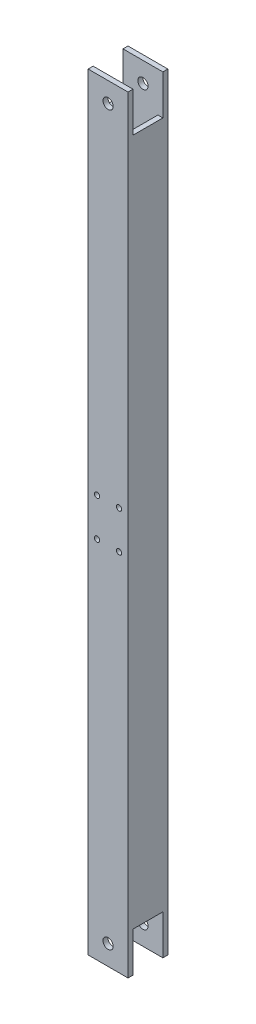
ISO-10303-21;
HEADER;
FILE_DESCRIPTION(('STEP AP214'),'2;1');
FILE_NAME('part.step','',(''),(''),'','','');
FILE_SCHEMA(('AUTOMOTIVE_DESIGN { 1 0 10303 214 1 1 1 1 }'));
ENDSEC;
DATA;
#1=APPLICATION_CONTEXT('core data for automotive mechanical design processes');
#2=APPLICATION_PROTOCOL_DEFINITION('international standard','automotive_design',2000,#1);
#3=PRODUCT_CONTEXT('',#1,'mechanical');
#4=PRODUCT('Part','Part','',(#3));
#5=PRODUCT_RELATED_PRODUCT_CATEGORY('part','',(#4));
#6=PRODUCT_DEFINITION_FORMATION('','',#4);
#7=PRODUCT_DEFINITION_CONTEXT('part definition',#1,'design');
#8=PRODUCT_DEFINITION('design','',#6,#7);
#9=PRODUCT_DEFINITION_SHAPE('','',#8);
#10=(LENGTH_UNIT() NAMED_UNIT(*) SI_UNIT(.MILLI.,.METRE.));
#11=(NAMED_UNIT(*) PLANE_ANGLE_UNIT() SI_UNIT($,.RADIAN.));
#12=(NAMED_UNIT(*) SI_UNIT($,.STERADIAN.) SOLID_ANGLE_UNIT());
#13=UNCERTAINTY_MEASURE_WITH_UNIT(LENGTH_MEASURE(1.E-05),#10,'distance_accuracy_value','');
#14=(GEOMETRIC_REPRESENTATION_CONTEXT(3) GLOBAL_UNCERTAINTY_ASSIGNED_CONTEXT((#13)) GLOBAL_UNIT_ASSIGNED_CONTEXT((#10,
#11,#12)) REPRESENTATION_CONTEXT('',''));
#15=CARTESIAN_POINT('',(0.,0.,0.));
#16=DIRECTION('',(0.,0.,1.));
#17=DIRECTION('',(1.,0.,0.));
#18=AXIS2_PLACEMENT_3D('',#15,#16,#17);
#19=CARTESIAN_POINT('',(0.,488.95,0.));
#20=DIRECTION('',(0.,1.,0.));
#21=DIRECTION('',(0.,0.,1.));
#22=AXIS2_PLACEMENT_3D('',#19,#20,#21);
#23=PLANE('',#22);
#24=DIRECTION('',(0.,0.,-1.));
#25=VECTOR('',#24,1.);
#26=CARTESIAN_POINT('',(25.4,488.95,0.));
#27=LINE('',#26,#25);
#28=CARTESIAN_POINT('',(25.4,488.95,25.4));
#29=VERTEX_POINT('',#28);
#30=CARTESIAN_POINT('',(25.4,488.95,22.225));
#31=VERTEX_POINT('',#30);
#32=EDGE_CURVE('E174',#29,#31,#27,.T.);
#33=ORIENTED_EDGE('',*,*,#32,.T.);
#34=DIRECTION('',(1.,0.,0.));
#35=VECTOR('',#34,1.);
#36=CARTESIAN_POINT('',(3.175,488.95,22.225));
#37=LINE('',#36,#35);
#38=CARTESIAN_POINT('',(0.,488.95,22.225));
#39=VERTEX_POINT('',#38);
#40=EDGE_CURVE('E155',#39,#31,#37,.T.);
#41=ORIENTED_EDGE('',*,*,#40,.F.);
#42=DIRECTION('',(0.,0.,1.));
#43=VECTOR('',#42,1.);
#44=CARTESIAN_POINT('',(0.,488.95,0.));
#45=LINE('',#44,#43);
#46=CARTESIAN_POINT('',(0.,488.95,25.4));
#47=VERTEX_POINT('',#46);
#48=EDGE_CURVE('E203',#39,#47,#45,.T.);
#49=ORIENTED_EDGE('',*,*,#48,.T.);
#50=DIRECTION('',(1.,0.,0.));
#51=VECTOR('',#50,1.);
#52=CARTESIAN_POINT('',(0.,488.95,25.4));
#53=LINE('',#52,#51);
#54=EDGE_CURVE('E181',#47,#29,#53,.T.);
#55=ORIENTED_EDGE('',*,*,#54,.T.);
#56=EDGE_LOOP('',(#33,#41,#49,#55));
#57=FACE_BOUND('',#56,.T.);
#58=ADVANCED_FACE('F41',(#57),#23,.T.);
#59=CARTESIAN_POINT('',(0.,488.95,0.));
#60=VERTEX_POINT('',#59);
#61=CARTESIAN_POINT('',(0.,488.95,3.175));
#62=VERTEX_POINT('',#61);
#63=EDGE_CURVE('E336',#60,#62,#45,.T.);
#64=ORIENTED_EDGE('',*,*,#63,.T.);
#65=DIRECTION('',(-1.,0.,0.));
#66=VECTOR('',#65,1.);
#67=CARTESIAN_POINT('',(3.175,488.95,3.175));
#68=LINE('',#67,#66);
#69=CARTESIAN_POINT('',(25.4,488.95,3.175));
#70=VERTEX_POINT('',#69);
#71=EDGE_CURVE('E166',#70,#62,#68,.T.);
#72=ORIENTED_EDGE('',*,*,#71,.F.);
#73=CARTESIAN_POINT('',(25.4,488.95,0.));
#74=VERTEX_POINT('',#73);
#75=EDGE_CURVE('E184',#70,#74,#27,.T.);
#76=ORIENTED_EDGE('',*,*,#75,.T.);
#77=DIRECTION('',(-1.,0.,0.));
#78=VECTOR('',#77,1.);
#79=CARTESIAN_POINT('',(0.,488.95,0.));
#80=LINE('',#79,#78);
#81=EDGE_CURVE('E183',#74,#60,#80,.T.);
#82=ORIENTED_EDGE('',*,*,#81,.T.);
#83=EDGE_LOOP('',(#64,#72,#76,#82));
#84=FACE_BOUND('',#83,.T.);
#85=ADVANCED_FACE('F374',(#84),#23,.T.);
#86=CARTESIAN_POINT('',(0.,488.95,0.));
#87=DIRECTION('',(1.,0.,0.));
#88=DIRECTION('',(0.,0.,-1.));
#89=AXIS2_PLACEMENT_3D('',#86,#87,#88);
#90=PLANE('',#89);
#91=DIRECTION('',(0.,-1.,0.));
#92=VECTOR('',#91,1.);
#93=CARTESIAN_POINT('',(0.,463.54943048716,22.225));
#94=LINE('',#93,#92);
#95=CARTESIAN_POINT('',(0.,463.54943048716,22.225));
#96=VERTEX_POINT('',#95);
#97=EDGE_CURVE('E162',#39,#96,#94,.T.);
#98=ORIENTED_EDGE('',*,*,#97,.T.);
#99=DIRECTION('',(0.,0.,-1.));
#100=VECTOR('',#99,1.);
#101=CARTESIAN_POINT('',(0.,463.54943048716,3.175));
#102=LINE('',#101,#100);
#103=CARTESIAN_POINT('',(0.,463.54943048716,3.175));
#104=VERTEX_POINT('',#103);
#105=EDGE_CURVE('E178',#96,#104,#102,.T.);
#106=ORIENTED_EDGE('',*,*,#105,.T.);
#107=DIRECTION('',(0.,1.,0.));
#108=VECTOR('',#107,1.);
#109=CARTESIAN_POINT('',(0.,488.95,3.175));
#110=LINE('',#109,#108);
#111=EDGE_CURVE('E248',#104,#62,#110,.T.);
#112=ORIENTED_EDGE('',*,*,#111,.T.);
#113=ORIENTED_EDGE('',*,*,#63,.F.);
#114=DIRECTION('',(0.,-1.,0.));
#115=VECTOR('',#114,1.);
#116=CARTESIAN_POINT('',(0.,488.95,0.));
#117=LINE('',#116,#115);
#118=CARTESIAN_POINT('',(0.,0.,0.));
#119=VERTEX_POINT('',#118);
#120=EDGE_CURVE('E186',#60,#119,#117,.T.);
#121=ORIENTED_EDGE('',*,*,#120,.T.);
#122=DIRECTION('',(0.,0.,1.));
#123=VECTOR('',#122,1.);
#124=CARTESIAN_POINT('',(0.,0.,0.));
#125=LINE('',#124,#123);
#126=CARTESIAN_POINT('',(0.,0.,3.175));
#127=VERTEX_POINT('',#126);
#128=EDGE_CURVE('E191',#119,#127,#125,.T.);
#129=ORIENTED_EDGE('',*,*,#128,.T.);
#130=DIRECTION('',(0.,-1.,0.));
#131=VECTOR('',#130,1.);
#132=CARTESIAN_POINT('',(0.,0.,3.175));
#133=LINE('',#132,#131);
#134=CARTESIAN_POINT('',(0.,25.4005695128399,3.175));
#135=VERTEX_POINT('',#134);
#136=EDGE_CURVE('E269',#135,#127,#133,.T.);
#137=ORIENTED_EDGE('',*,*,#136,.F.);
#138=DIRECTION('',(0.,0.,-1.));
#139=VECTOR('',#138,1.);
#140=CARTESIAN_POINT('',(0.,25.4005695128399,3.175));
#141=LINE('',#140,#139);
#142=CARTESIAN_POINT('',(0.,25.4005695128399,22.225));
#143=VERTEX_POINT('',#142);
#144=EDGE_CURVE('E278',#143,#135,#141,.T.);
#145=ORIENTED_EDGE('',*,*,#144,.F.);
#146=DIRECTION('',(0.,1.,0.));
#147=VECTOR('',#146,1.);
#148=CARTESIAN_POINT('',(0.,25.4005695128399,22.225));
#149=LINE('',#148,#147);
#150=CARTESIAN_POINT('',(0.,0.,22.225));
#151=VERTEX_POINT('',#150);
#152=EDGE_CURVE('E264',#151,#143,#149,.T.);
#153=ORIENTED_EDGE('',*,*,#152,.F.);
#154=CARTESIAN_POINT('',(0.,0.,25.4));
#155=VERTEX_POINT('',#154);
#156=EDGE_CURVE('E195',#151,#155,#125,.T.);
#157=ORIENTED_EDGE('',*,*,#156,.T.);
#158=DIRECTION('',(0.,-1.,0.));
#159=VECTOR('',#158,1.);
#160=CARTESIAN_POINT('',(0.,488.95,25.4));
#161=LINE('',#160,#159);
#162=EDGE_CURVE('E11',#47,#155,#161,.T.);
#163=ORIENTED_EDGE('',*,*,#162,.F.);
#164=ORIENTED_EDGE('',*,*,#48,.F.);
#165=EDGE_LOOP('',(#98,#106,#112,#113,#121,#129,#137,#145,#153,#157,#163,#164));
#166=FACE_BOUND('',#165,.T.);
#167=ADVANCED_FACE('F43',(#166),#90,.F.);
#168=CARTESIAN_POINT('',(25.4,488.95,0.));
#169=DIRECTION('',(-1.,0.,0.));
#170=DIRECTION('',(0.,0.,1.));
#171=AXIS2_PLACEMENT_3D('',#168,#169,#170);
#172=PLANE('',#171);
#173=DIRECTION('',(0.,-1.,0.));
#174=VECTOR('',#173,1.);
#175=CARTESIAN_POINT('',(25.4,463.54943048716,22.225));
#176=LINE('',#175,#174);
#177=CARTESIAN_POINT('',(25.4,463.54943048716,22.225));
#178=VERTEX_POINT('',#177);
#179=EDGE_CURVE('E159',#31,#178,#176,.T.);
#180=ORIENTED_EDGE('',*,*,#179,.F.);
#181=ORIENTED_EDGE('',*,*,#32,.F.);
#182=DIRECTION('',(0.,-1.,0.));
#183=VECTOR('',#182,1.);
#184=CARTESIAN_POINT('',(25.4,488.95,25.4));
#185=LINE('',#184,#183);
#186=CARTESIAN_POINT('',(25.4,0.,25.4));
#187=VERTEX_POINT('',#186);
#188=EDGE_CURVE('E50',#29,#187,#185,.T.);
#189=ORIENTED_EDGE('',*,*,#188,.T.);
#190=DIRECTION('',(0.,0.,-1.));
#191=VECTOR('',#190,1.);
#192=CARTESIAN_POINT('',(25.4,0.,0.));
#193=LINE('',#192,#191);
#194=CARTESIAN_POINT('',(25.4,0.,22.225));
#195=VERTEX_POINT('',#194);
#196=EDGE_CURVE('E198',#187,#195,#193,.T.);
#197=ORIENTED_EDGE('',*,*,#196,.T.);
#198=DIRECTION('',(0.,1.,0.));
#199=VECTOR('',#198,1.);
#200=CARTESIAN_POINT('',(25.4,25.4005695128399,22.225));
#201=LINE('',#200,#199);
#202=CARTESIAN_POINT('',(25.4,25.4005695128399,22.225));
#203=VERTEX_POINT('',#202);
#204=EDGE_CURVE('E265',#195,#203,#201,.T.);
#205=ORIENTED_EDGE('',*,*,#204,.T.);
#206=DIRECTION('',(0.,0.,-1.));
#207=VECTOR('',#206,1.);
#208=CARTESIAN_POINT('',(25.4,25.4005695128399,3.175));
#209=LINE('',#208,#207);
#210=CARTESIAN_POINT('',(25.4,25.4005695128399,3.175));
#211=VERTEX_POINT('',#210);
#212=EDGE_CURVE('E268',#203,#211,#209,.T.);
#213=ORIENTED_EDGE('',*,*,#212,.T.);
#214=DIRECTION('',(0.,-1.,0.));
#215=VECTOR('',#214,1.);
#216=CARTESIAN_POINT('',(25.4,0.,3.175));
#217=LINE('',#216,#215);
#218=CARTESIAN_POINT('',(25.4,0.,3.175));
#219=VERTEX_POINT('',#218);
#220=EDGE_CURVE('E272',#211,#219,#217,.T.);
#221=ORIENTED_EDGE('',*,*,#220,.T.);
#222=CARTESIAN_POINT('',(25.4,0.,0.));
#223=VERTEX_POINT('',#222);
#224=EDGE_CURVE('E197',#219,#223,#193,.T.);
#225=ORIENTED_EDGE('',*,*,#224,.T.);
#226=DIRECTION('',(0.,-1.,0.));
#227=VECTOR('',#226,1.);
#228=CARTESIAN_POINT('',(25.4,488.95,0.));
#229=LINE('',#228,#227);
#230=EDGE_CURVE('E206',#74,#223,#229,.T.);
#231=ORIENTED_EDGE('',*,*,#230,.F.);
#232=ORIENTED_EDGE('',*,*,#75,.F.);
#233=DIRECTION('',(0.,1.,0.));
#234=VECTOR('',#233,1.);
#235=CARTESIAN_POINT('',(25.4,488.95,3.175));
#236=LINE('',#235,#234);
#237=CARTESIAN_POINT('',(25.4,463.54943048716,3.175));
#238=VERTEX_POINT('',#237);
#239=EDGE_CURVE('E177',#238,#70,#236,.T.);
#240=ORIENTED_EDGE('',*,*,#239,.F.);
#241=DIRECTION('',(0.,0.,-1.));
#242=VECTOR('',#241,1.);
#243=CARTESIAN_POINT('',(25.4,463.54943048716,3.175));
#244=LINE('',#243,#242);
#245=EDGE_CURVE('E176',#178,#238,#244,.T.);
#246=ORIENTED_EDGE('',*,*,#245,.F.);
#247=EDGE_LOOP('',(#180,#181,#189,#197,#205,#213,#221,#225,#231,#232,#240,#246));
#248=FACE_BOUND('',#247,.T.);
#249=ADVANCED_FACE('F172',(#248),#172,.F.);
#250=CARTESIAN_POINT('',(3.175,488.95,3.175));
#251=DIRECTION('',(1.,0.,0.));
#252=DIRECTION('',(0.,0.,-1.));
#253=AXIS2_PLACEMENT_3D('',#250,#251,#252);
#254=PLANE('',#253);
#255=DIRECTION('',(0.,-1.,0.));
#256=VECTOR('',#255,1.);
#257=CARTESIAN_POINT('',(3.175,488.95,3.175));
#258=LINE('',#257,#256);
#259=CARTESIAN_POINT('',(3.175,463.54943048716,3.175));
#260=VERTEX_POINT('',#259);
#261=CARTESIAN_POINT('',(3.175,25.4005695128399,3.175));
#262=VERTEX_POINT('',#261);
#263=EDGE_CURVE('E328',#260,#262,#258,.T.);
#264=ORIENTED_EDGE('',*,*,#263,.F.);
#265=DIRECTION('',(0.,0.,1.));
#266=VECTOR('',#265,1.);
#267=CARTESIAN_POINT('',(3.175,463.54943048716,3.175));
#268=LINE('',#267,#266);
#269=CARTESIAN_POINT('',(3.175,463.54943048716,22.225));
#270=VERTEX_POINT('',#269);
#271=EDGE_CURVE('E261',#260,#270,#268,.T.);
#272=ORIENTED_EDGE('',*,*,#271,.T.);
#273=DIRECTION('',(0.,-1.,0.));
#274=VECTOR('',#273,1.);
#275=CARTESIAN_POINT('',(3.175,488.95,22.225));
#276=LINE('',#275,#274);
#277=CARTESIAN_POINT('',(3.17500000000001,25.4005695128399,22.225));
#278=VERTEX_POINT('',#277);
#279=EDGE_CURVE('E335',#270,#278,#276,.T.);
#280=ORIENTED_EDGE('',*,*,#279,.T.);
#281=DIRECTION('',(0.,0.,1.));
#282=VECTOR('',#281,1.);
#283=CARTESIAN_POINT('',(3.175,25.4005695128399,3.175));
#284=LINE('',#283,#282);
#285=EDGE_CURVE('E292',#262,#278,#284,.T.);
#286=ORIENTED_EDGE('',*,*,#285,.F.);
#287=EDGE_LOOP('',(#264,#272,#280,#286));
#288=FACE_BOUND('',#287,.T.);
#289=ADVANCED_FACE('F383',(#288),#254,.T.);
#290=CARTESIAN_POINT('',(22.225,488.95,3.175));
#291=DIRECTION('',(-1.,0.,0.));
#292=DIRECTION('',(0.,0.,1.));
#293=AXIS2_PLACEMENT_3D('',#290,#291,#292);
#294=PLANE('',#293);
#295=DIRECTION('',(0.,-1.,0.));
#296=VECTOR('',#295,1.);
#297=CARTESIAN_POINT('',(22.225,488.95,22.225));
#298=LINE('',#297,#296);
#299=CARTESIAN_POINT('',(22.225,463.54943048716,22.225));
#300=VERTEX_POINT('',#299);
#301=CARTESIAN_POINT('',(22.225,25.4005695128399,22.225));
#302=VERTEX_POINT('',#301);
#303=EDGE_CURVE('E66',#300,#302,#298,.T.);
#304=ORIENTED_EDGE('',*,*,#303,.F.);
#305=DIRECTION('',(0.,0.,-1.));
#306=VECTOR('',#305,1.);
#307=CARTESIAN_POINT('',(22.225,463.54943048716,3.175));
#308=LINE('',#307,#306);
#309=CARTESIAN_POINT('',(22.225,463.54943048716,3.175));
#310=VERTEX_POINT('',#309);
#311=EDGE_CURVE('E255',#300,#310,#308,.T.);
#312=ORIENTED_EDGE('',*,*,#311,.T.);
#313=DIRECTION('',(0.,-1.,0.));
#314=VECTOR('',#313,1.);
#315=CARTESIAN_POINT('',(22.225,488.95,3.175));
#316=LINE('',#315,#314);
#317=CARTESIAN_POINT('',(22.225,25.4005695128399,3.175));
#318=VERTEX_POINT('',#317);
#319=EDGE_CURVE('E332',#310,#318,#316,.T.);
#320=ORIENTED_EDGE('',*,*,#319,.T.);
#321=DIRECTION('',(0.,0.,-1.));
#322=VECTOR('',#321,1.);
#323=CARTESIAN_POINT('',(22.225,25.4005695128399,3.175));
#324=LINE('',#323,#322);
#325=EDGE_CURVE('E286',#302,#318,#324,.T.);
#326=ORIENTED_EDGE('',*,*,#325,.F.);
#327=EDGE_LOOP('',(#304,#312,#320,#326));
#328=FACE_BOUND('',#327,.T.);
#329=ADVANCED_FACE('F451',(#328),#294,.T.);
#330=CARTESIAN_POINT('',(0.,0.,0.));
#331=DIRECTION('',(0.,1.,0.));
#332=DIRECTION('',(0.,0.,1.));
#333=AXIS2_PLACEMENT_3D('',#330,#331,#332);
#334=PLANE('',#333);
#335=ORIENTED_EDGE('',*,*,#156,.F.);
#336=DIRECTION('',(1.,0.,0.));
#337=VECTOR('',#336,1.);
#338=CARTESIAN_POINT('',(3.175,0.,22.225));
#339=LINE('',#338,#337);
#340=EDGE_CURVE('E325',#151,#195,#339,.T.);
#341=ORIENTED_EDGE('',*,*,#340,.T.);
#342=ORIENTED_EDGE('',*,*,#196,.F.);
#343=DIRECTION('',(1.,0.,0.));
#344=VECTOR('',#343,1.);
#345=CARTESIAN_POINT('',(0.,0.,25.4));
#346=LINE('',#345,#344);
#347=EDGE_CURVE('E194',#155,#187,#346,.T.);
#348=ORIENTED_EDGE('',*,*,#347,.F.);
#349=EDGE_LOOP('',(#335,#341,#342,#348));
#350=FACE_BOUND('',#349,.T.);
#351=ADVANCED_FACE('F350',(#350),#334,.F.);
#352=ORIENTED_EDGE('',*,*,#224,.F.);
#353=DIRECTION('',(-1.,0.,0.));
#354=VECTOR('',#353,1.);
#355=CARTESIAN_POINT('',(3.175,0.,3.175));
#356=LINE('',#355,#354);
#357=EDGE_CURVE('E167',#219,#127,#356,.T.);
#358=ORIENTED_EDGE('',*,*,#357,.T.);
#359=ORIENTED_EDGE('',*,*,#128,.F.);
#360=DIRECTION('',(-1.,0.,0.));
#361=VECTOR('',#360,1.);
#362=CARTESIAN_POINT('',(0.,0.,0.));
#363=LINE('',#362,#361);
#364=EDGE_CURVE('E201',#223,#119,#363,.T.);
#365=ORIENTED_EDGE('',*,*,#364,.F.);
#366=EDGE_LOOP('',(#352,#358,#359,#365));
#367=FACE_BOUND('',#366,.T.);
#368=ADVANCED_FACE('F364',(#367),#334,.F.);
#369=CARTESIAN_POINT('',(0.,488.95,25.4));
#370=DIRECTION('',(0.,0.,-1.));
#371=DIRECTION('',(-1.,0.,0.));
#372=AXIS2_PLACEMENT_3D('',#369,#370,#371);
#373=PLANE('',#372);
#374=CARTESIAN_POINT('',(12.7,476.25,25.4));
#375=DIRECTION('',(0.,0.,-1.));
#376=DIRECTION('',(1.,0.,0.));
#377=AXIS2_PLACEMENT_3D('',#374,#375,#376);
#378=CIRCLE('',#377,3.2639);
#379=CARTESIAN_POINT('',(15.9639,476.25,25.4));
#380=VERTEX_POINT('',#379);
#381=EDGE_CURVE('E399',#380,#380,#378,.T.);
#382=ORIENTED_EDGE('',*,*,#381,.T.);
#383=EDGE_LOOP('',(#382));
#384=FACE_BOUND('',#383,.T.);
#385=CARTESIAN_POINT('',(12.7,12.7,25.4));
#386=DIRECTION('',(0.,0.,1.));
#387=DIRECTION('',(1.,0.,0.));
#388=AXIS2_PLACEMENT_3D('',#385,#386,#387);
#389=CIRCLE('',#388,3.2639);
#390=CARTESIAN_POINT('',(15.9639,12.7,25.4));
#391=VERTEX_POINT('',#390);
#392=EDGE_CURVE('E235',#391,#391,#389,.T.);
#393=ORIENTED_EDGE('',*,*,#392,.F.);
#394=EDGE_LOOP('',(#393));
#395=FACE_BOUND('',#394,.T.);
#396=CARTESIAN_POINT('',(5.69999999999998,232.350644347018,25.4));
#397=DIRECTION('',(0.,0.,-1.));
#398=DIRECTION('',(-1.,0.,0.));
#399=AXIS2_PLACEMENT_3D('',#396,#397,#398);
#400=CIRCLE('',#399,1.7);
#401=CARTESIAN_POINT('',(3.99999999999998,232.350644347018,25.4));
#402=VERTEX_POINT('',#401);
#403=EDGE_CURVE('E295',#402,#402,#400,.F.);
#404=ORIENTED_EDGE('',*,*,#403,.F.);
#405=EDGE_LOOP('',(#404));
#406=FACE_BOUND('',#405,.T.);
#407=CARTESIAN_POINT('',(19.7,232.350644347018,25.4));
#408=DIRECTION('',(0.,0.,-1.));
#409=DIRECTION('',(-1.,0.,0.));
#410=AXIS2_PLACEMENT_3D('',#407,#408,#409);
#411=CIRCLE('',#410,1.69999999999999);
#412=CARTESIAN_POINT('',(18.,232.350644347018,25.4));
#413=VERTEX_POINT('',#412);
#414=EDGE_CURVE('E304',#413,#413,#411,.F.);
#415=ORIENTED_EDGE('',*,*,#414,.F.);
#416=EDGE_LOOP('',(#415));
#417=FACE_BOUND('',#416,.T.);
#418=CARTESIAN_POINT('',(19.7,256.599355652982,25.4));
#419=DIRECTION('',(0.,0.,-1.));
#420=DIRECTION('',(-1.,0.,0.));
#421=AXIS2_PLACEMENT_3D('',#418,#419,#420);
#422=CIRCLE('',#421,1.69999999999998);
#423=CARTESIAN_POINT('',(18.,256.599355652982,25.4));
#424=VERTEX_POINT('',#423);
#425=EDGE_CURVE('E296',#424,#424,#422,.F.);
#426=ORIENTED_EDGE('',*,*,#425,.F.);
#427=EDGE_LOOP('',(#426));
#428=FACE_BOUND('',#427,.T.);
#429=CARTESIAN_POINT('',(5.70000000000001,256.599355652982,25.4));
#430=DIRECTION('',(0.,0.,-1.));
#431=DIRECTION('',(-1.,0.,0.));
#432=AXIS2_PLACEMENT_3D('',#429,#430,#431);
#433=CIRCLE('',#432,1.69999999999998);
#434=CARTESIAN_POINT('',(4.00000000000003,256.599355652982,25.4));
#435=VERTEX_POINT('',#434);
#436=EDGE_CURVE('E214',#435,#435,#433,.F.);
#437=ORIENTED_EDGE('',*,*,#436,.F.);
#438=EDGE_LOOP('',(#437));
#439=FACE_BOUND('',#438,.T.);
#440=ORIENTED_EDGE('',*,*,#347,.T.);
#441=ORIENTED_EDGE('',*,*,#188,.F.);
#442=ORIENTED_EDGE('',*,*,#54,.F.);
#443=ORIENTED_EDGE('',*,*,#162,.T.);
#444=EDGE_LOOP('',(#440,#441,#442,#443));
#445=FACE_BOUND('',#444,.T.);
#446=ADVANCED_FACE('F343',(#384,#395,#406,#417,#428,#439,#445),#373,.F.);
#447=CARTESIAN_POINT('',(0.,488.95,0.));
#448=DIRECTION('',(0.,0.,1.));
#449=DIRECTION('',(1.,0.,0.));
#450=AXIS2_PLACEMENT_3D('',#447,#448,#449);
#451=PLANE('',#450);
#452=CARTESIAN_POINT('',(12.7,476.25,0.));
#453=DIRECTION('',(0.,0.,1.));
#454=DIRECTION('',(1.,0.,0.));
#455=AXIS2_PLACEMENT_3D('',#452,#453,#454);
#456=CIRCLE('',#455,3.2639);
#457=CARTESIAN_POINT('',(15.9639,476.25,0.));
#458=VERTEX_POINT('',#457);
#459=EDGE_CURVE('E592',#458,#458,#456,.T.);
#460=ORIENTED_EDGE('',*,*,#459,.T.);
#461=EDGE_LOOP('',(#460));
#462=FACE_BOUND('',#461,.T.);
#463=CARTESIAN_POINT('',(12.7,12.7,0.));
#464=DIRECTION('',(0.,0.,1.));
#465=DIRECTION('',(1.,0.,0.));
#466=AXIS2_PLACEMENT_3D('',#463,#464,#465);
#467=CIRCLE('',#466,3.2639);
#468=CARTESIAN_POINT('',(15.9639,12.7,0.));
#469=VERTEX_POINT('',#468);
#470=EDGE_CURVE('E229',#469,#469,#467,.F.);
#471=ORIENTED_EDGE('',*,*,#470,.F.);
#472=EDGE_LOOP('',(#471));
#473=FACE_BOUND('',#472,.T.);
#474=CARTESIAN_POINT('',(5.69999999999998,232.350644347018,0.));
#475=DIRECTION('',(0.,0.,-1.));
#476=DIRECTION('',(-1.,0.,0.));
#477=AXIS2_PLACEMENT_3D('',#474,#475,#476);
#478=CIRCLE('',#477,1.7);
#479=CARTESIAN_POINT('',(3.99999999999998,232.350644347018,0.));
#480=VERTEX_POINT('',#479);
#481=EDGE_CURVE('E307',#480,#480,#478,.T.);
#482=ORIENTED_EDGE('',*,*,#481,.F.);
#483=EDGE_LOOP('',(#482));
#484=FACE_BOUND('',#483,.T.);
#485=CARTESIAN_POINT('',(19.7,232.350644347018,0.));
#486=DIRECTION('',(0.,0.,-1.));
#487=DIRECTION('',(-1.,0.,0.));
#488=AXIS2_PLACEMENT_3D('',#485,#486,#487);
#489=CIRCLE('',#488,1.69999999999999);
#490=CARTESIAN_POINT('',(18.,232.350644347018,0.));
#491=VERTEX_POINT('',#490);
#492=EDGE_CURVE('E300',#491,#491,#489,.T.);
#493=ORIENTED_EDGE('',*,*,#492,.F.);
#494=EDGE_LOOP('',(#493));
#495=FACE_BOUND('',#494,.T.);
#496=CARTESIAN_POINT('',(19.7,256.599355652982,0.));
#497=DIRECTION('',(0.,0.,-1.));
#498=DIRECTION('',(-1.,0.,0.));
#499=AXIS2_PLACEMENT_3D('',#496,#497,#498);
#500=CIRCLE('',#499,1.69999999999998);
#501=CARTESIAN_POINT('',(18.,256.599355652982,0.));
#502=VERTEX_POINT('',#501);
#503=EDGE_CURVE('E299',#502,#502,#500,.T.);
#504=ORIENTED_EDGE('',*,*,#503,.F.);
#505=EDGE_LOOP('',(#504));
#506=FACE_BOUND('',#505,.T.);
#507=CARTESIAN_POINT('',(5.70000000000001,256.599355652982,0.));
#508=DIRECTION('',(0.,0.,-1.));
#509=DIRECTION('',(-1.,0.,0.));
#510=AXIS2_PLACEMENT_3D('',#507,#508,#509);
#511=CIRCLE('',#510,1.69999999999998);
#512=CARTESIAN_POINT('',(4.00000000000003,256.599355652982,0.));
#513=VERTEX_POINT('',#512);
#514=EDGE_CURVE('E303',#513,#513,#511,.T.);
#515=ORIENTED_EDGE('',*,*,#514,.F.);
#516=EDGE_LOOP('',(#515));
#517=FACE_BOUND('',#516,.T.);
#518=ORIENTED_EDGE('',*,*,#364,.T.);
#519=ORIENTED_EDGE('',*,*,#120,.F.);
#520=ORIENTED_EDGE('',*,*,#81,.F.);
#521=ORIENTED_EDGE('',*,*,#230,.T.);
#522=EDGE_LOOP('',(#518,#519,#520,#521));
#523=FACE_BOUND('',#522,.T.);
#524=ADVANCED_FACE('F368',(#462,#473,#484,#495,#506,#517,#523),#451,.F.);
#525=CARTESIAN_POINT('',(3.175,488.95,22.225));
#526=DIRECTION('',(0.,0.,-1.));
#527=DIRECTION('',(-1.,0.,0.));
#528=AXIS2_PLACEMENT_3D('',#525,#526,#527);
#529=PLANE('',#528);
#530=CARTESIAN_POINT('',(12.7,476.25,22.225));
#531=DIRECTION('',(0.,0.,-1.));
#532=DIRECTION('',(-1.,0.,0.));
#533=AXIS2_PLACEMENT_3D('',#530,#531,#532);
#534=CIRCLE('',#533,3.2639);
#535=CARTESIAN_POINT('',(9.4361,476.25,22.225));
#536=VERTEX_POINT('',#535);
#537=EDGE_CURVE('E240',#536,#536,#534,.F.);
#538=ORIENTED_EDGE('',*,*,#537,.T.);
#539=EDGE_LOOP('',(#538));
#540=FACE_BOUND('',#539,.T.);
#541=CARTESIAN_POINT('',(12.7,12.7,22.225));
#542=DIRECTION('',(0.,0.,-1.));
#543=DIRECTION('',(-1.,0.,0.));
#544=AXIS2_PLACEMENT_3D('',#541,#542,#543);
#545=CIRCLE('',#544,3.2639);
#546=CARTESIAN_POINT('',(9.4361,12.7,22.225));
#547=VERTEX_POINT('',#546);
#548=EDGE_CURVE('E228',#547,#547,#545,.T.);
#549=ORIENTED_EDGE('',*,*,#548,.F.);
#550=EDGE_LOOP('',(#549));
#551=FACE_BOUND('',#550,.T.);
#552=DIRECTION('',(-1.,0.,0.));
#553=VECTOR('',#552,1.);
#554=CARTESIAN_POINT('',(25.4,463.54943048716,22.225));
#555=LINE('',#554,#553);
#556=EDGE_CURVE('E253',#178,#300,#555,.T.);
#557=ORIENTED_EDGE('',*,*,#556,.T.);
#558=ORIENTED_EDGE('',*,*,#303,.T.);
#559=DIRECTION('',(-1.,0.,0.));
#560=VECTOR('',#559,1.);
#561=CARTESIAN_POINT('',(25.4,25.4005695128399,22.225));
#562=LINE('',#561,#560);
#563=EDGE_CURVE('E288',#203,#302,#562,.T.);
#564=ORIENTED_EDGE('',*,*,#563,.F.);
#565=ORIENTED_EDGE('',*,*,#204,.F.);
#566=ORIENTED_EDGE('',*,*,#340,.F.);
#567=ORIENTED_EDGE('',*,*,#152,.T.);
#568=EDGE_CURVE('E275',#278,#143,#562,.T.);
#569=ORIENTED_EDGE('',*,*,#568,.F.);
#570=ORIENTED_EDGE('',*,*,#279,.F.);
#571=EDGE_CURVE('E256',#270,#96,#555,.T.);
#572=ORIENTED_EDGE('',*,*,#571,.T.);
#573=ORIENTED_EDGE('',*,*,#97,.F.);
#574=ORIENTED_EDGE('',*,*,#40,.T.);
#575=ORIENTED_EDGE('',*,*,#179,.T.);
#576=EDGE_LOOP('',(#557,#558,#564,#565,#566,#567,#569,#570,#572,#573,#574,#575));
#577=FACE_BOUND('',#576,.T.);
#578=CARTESIAN_POINT('',(5.69999999999998,232.350644347018,22.225));
#579=DIRECTION('',(0.,0.,-1.));
#580=DIRECTION('',(-1.,0.,0.));
#581=AXIS2_PLACEMENT_3D('',#578,#579,#580);
#582=CIRCLE('',#581,1.7);
#583=CARTESIAN_POINT('',(3.99999999999998,232.350644347018,22.225));
#584=VERTEX_POINT('',#583);
#585=EDGE_CURVE('E225',#584,#584,#582,.T.);
#586=ORIENTED_EDGE('',*,*,#585,.F.);
#587=EDGE_LOOP('',(#586));
#588=FACE_BOUND('',#587,.T.);
#589=CARTESIAN_POINT('',(19.7,232.350644347018,22.225));
#590=DIRECTION('',(0.,0.,-1.));
#591=DIRECTION('',(-1.,0.,0.));
#592=AXIS2_PLACEMENT_3D('',#589,#590,#591);
#593=CIRCLE('',#592,1.69999999999999);
#594=CARTESIAN_POINT('',(18.,232.350644347018,22.225));
#595=VERTEX_POINT('',#594);
#596=EDGE_CURVE('E222',#595,#595,#593,.T.);
#597=ORIENTED_EDGE('',*,*,#596,.F.);
#598=EDGE_LOOP('',(#597));
#599=FACE_BOUND('',#598,.T.);
#600=CARTESIAN_POINT('',(19.7,256.599355652982,22.225));
#601=DIRECTION('',(0.,0.,-1.));
#602=DIRECTION('',(-1.,0.,0.));
#603=AXIS2_PLACEMENT_3D('',#600,#601,#602);
#604=CIRCLE('',#603,1.69999999999998);
#605=CARTESIAN_POINT('',(18.,256.599355652982,22.225));
#606=VERTEX_POINT('',#605);
#607=EDGE_CURVE('E218',#606,#606,#604,.T.);
#608=ORIENTED_EDGE('',*,*,#607,.F.);
#609=EDGE_LOOP('',(#608));
#610=FACE_BOUND('',#609,.T.);
#611=CARTESIAN_POINT('',(5.70000000000001,256.599355652982,22.225));
#612=DIRECTION('',(0.,0.,-1.));
#613=DIRECTION('',(-1.,0.,0.));
#614=AXIS2_PLACEMENT_3D('',#611,#612,#613);
#615=CIRCLE('',#614,1.69999999999998);
#616=CARTESIAN_POINT('',(4.00000000000003,256.599355652982,22.225));
#617=VERTEX_POINT('',#616);
#618=EDGE_CURVE('E213',#617,#617,#615,.T.);
#619=ORIENTED_EDGE('',*,*,#618,.F.);
#620=EDGE_LOOP('',(#619));
#621=FACE_BOUND('',#620,.T.);
#622=ADVANCED_FACE('F157',(#540,#551,#577,#588,#599,#610,#621),#529,.T.);
#623=CARTESIAN_POINT('',(3.175,488.95,3.175));
#624=DIRECTION('',(0.,0.,1.));
#625=DIRECTION('',(1.,0.,0.));
#626=AXIS2_PLACEMENT_3D('',#623,#624,#625);
#627=PLANE('',#626);
#628=CARTESIAN_POINT('',(12.7,476.25,3.175));
#629=DIRECTION('',(0.,0.,1.));
#630=DIRECTION('',(1.,0.,0.));
#631=AXIS2_PLACEMENT_3D('',#628,#629,#630);
#632=CIRCLE('',#631,3.2639);
#633=CARTESIAN_POINT('',(15.9639,476.25,3.175));
#634=VERTEX_POINT('',#633);
#635=EDGE_CURVE('E45',#634,#634,#632,.F.);
#636=ORIENTED_EDGE('',*,*,#635,.T.);
#637=EDGE_LOOP('',(#636));
#638=FACE_BOUND('',#637,.T.);
#639=CARTESIAN_POINT('',(12.7,12.7,3.175));
#640=DIRECTION('',(0.,0.,1.));
#641=DIRECTION('',(1.,0.,0.));
#642=AXIS2_PLACEMENT_3D('',#639,#640,#641);
#643=CIRCLE('',#642,3.2639);
#644=CARTESIAN_POINT('',(15.9639,12.7,3.175));
#645=VERTEX_POINT('',#644);
#646=EDGE_CURVE('E226',#645,#645,#643,.T.);
#647=ORIENTED_EDGE('',*,*,#646,.F.);
#648=EDGE_LOOP('',(#647));
#649=FACE_BOUND('',#648,.T.);
#650=ORIENTED_EDGE('',*,*,#71,.T.);
#651=ORIENTED_EDGE('',*,*,#111,.F.);
#652=DIRECTION('',(-1.,0.,0.));
#653=VECTOR('',#652,1.);
#654=CARTESIAN_POINT('',(25.4,463.54943048716,3.175));
#655=LINE('',#654,#653);
#656=EDGE_CURVE('E58',#260,#104,#655,.T.);
#657=ORIENTED_EDGE('',*,*,#656,.F.);
#658=ORIENTED_EDGE('',*,*,#263,.T.);
#659=DIRECTION('',(-1.,0.,0.));
#660=VECTOR('',#659,1.);
#661=CARTESIAN_POINT('',(25.4,25.4005695128399,3.175));
#662=LINE('',#661,#660);
#663=EDGE_CURVE('E287',#262,#135,#662,.T.);
#664=ORIENTED_EDGE('',*,*,#663,.T.);
#665=ORIENTED_EDGE('',*,*,#136,.T.);
#666=ORIENTED_EDGE('',*,*,#357,.F.);
#667=ORIENTED_EDGE('',*,*,#220,.F.);
#668=EDGE_CURVE('E283',#211,#318,#662,.T.);
#669=ORIENTED_EDGE('',*,*,#668,.T.);
#670=ORIENTED_EDGE('',*,*,#319,.F.);
#671=EDGE_CURVE('E257',#238,#310,#655,.T.);
#672=ORIENTED_EDGE('',*,*,#671,.F.);
#673=ORIENTED_EDGE('',*,*,#239,.T.);
#674=EDGE_LOOP('',(#650,#651,#657,#658,#664,#665,#666,#667,#669,#670,#672,#673));
#675=FACE_BOUND('',#674,.T.);
#676=CARTESIAN_POINT('',(5.69999999999998,232.350644347018,3.175));
#677=DIRECTION('',(0.,0.,1.));
#678=DIRECTION('',(1.,0.,0.));
#679=AXIS2_PLACEMENT_3D('',#676,#677,#678);
#680=CIRCLE('',#679,1.7);
#681=CARTESIAN_POINT('',(7.39999999999998,232.350644347018,3.175));
#682=VERTEX_POINT('',#681);
#683=EDGE_CURVE('E223',#682,#682,#680,.T.);
#684=ORIENTED_EDGE('',*,*,#683,.F.);
#685=EDGE_LOOP('',(#684));
#686=FACE_BOUND('',#685,.T.);
#687=CARTESIAN_POINT('',(19.7,232.350644347018,3.175));
#688=DIRECTION('',(0.,0.,1.));
#689=DIRECTION('',(1.,0.,0.));
#690=AXIS2_PLACEMENT_3D('',#687,#688,#689);
#691=CIRCLE('',#690,1.69999999999999);
#692=CARTESIAN_POINT('',(21.4,232.350644347018,3.175));
#693=VERTEX_POINT('',#692);
#694=EDGE_CURVE('E219',#693,#693,#691,.T.);
#695=ORIENTED_EDGE('',*,*,#694,.F.);
#696=EDGE_LOOP('',(#695));
#697=FACE_BOUND('',#696,.T.);
#698=CARTESIAN_POINT('',(19.7,256.599355652982,3.175));
#699=DIRECTION('',(0.,0.,1.));
#700=DIRECTION('',(1.,0.,0.));
#701=AXIS2_PLACEMENT_3D('',#698,#699,#700);
#702=CIRCLE('',#701,1.69999999999998);
#703=CARTESIAN_POINT('',(21.3999999999999,256.599355652982,3.175));
#704=VERTEX_POINT('',#703);
#705=EDGE_CURVE('E215',#704,#704,#702,.T.);
#706=ORIENTED_EDGE('',*,*,#705,.F.);
#707=EDGE_LOOP('',(#706));
#708=FACE_BOUND('',#707,.T.);
#709=CARTESIAN_POINT('',(5.70000000000001,256.599355652982,3.175));
#710=DIRECTION('',(0.,0.,1.));
#711=DIRECTION('',(1.,0.,0.));
#712=AXIS2_PLACEMENT_3D('',#709,#710,#711);
#713=CIRCLE('',#712,1.69999999999998);
#714=CARTESIAN_POINT('',(7.39999999999999,256.599355652982,3.175));
#715=VERTEX_POINT('',#714);
#716=EDGE_CURVE('E210',#715,#715,#713,.T.);
#717=ORIENTED_EDGE('',*,*,#716,.F.);
#718=EDGE_LOOP('',(#717));
#719=FACE_BOUND('',#718,.T.);
#720=ADVANCED_FACE('F358',(#638,#649,#675,#686,#697,#708,#719),#627,.T.);
#721=CARTESIAN_POINT('',(5.70000000000001,256.599355652982,30.2083261120685));
#722=DIRECTION('',(0.,0.,-1.));
#723=DIRECTION('',(-1.,0.,0.));
#724=AXIS2_PLACEMENT_3D('',#721,#722,#723);
#725=CYLINDRICAL_SURFACE('',#724,1.69999999999998);
#726=ORIENTED_EDGE('',*,*,#716,.T.);
#727=EDGE_LOOP('',(#726));
#728=FACE_BOUND('',#727,.T.);
#729=ORIENTED_EDGE('',*,*,#514,.T.);
#730=EDGE_LOOP('',(#729));
#731=FACE_BOUND('',#730,.T.);
#732=ADVANCED_FACE('F416',(#728,#731),#725,.F.);
#733=CARTESIAN_POINT('',(19.7,256.599355652982,30.2083261120685));
#734=DIRECTION('',(0.,0.,-1.));
#735=DIRECTION('',(-1.,0.,0.));
#736=AXIS2_PLACEMENT_3D('',#733,#734,#735);
#737=CYLINDRICAL_SURFACE('',#736,1.69999999999998);
#738=ORIENTED_EDGE('',*,*,#705,.T.);
#739=EDGE_LOOP('',(#738));
#740=FACE_BOUND('',#739,.T.);
#741=ORIENTED_EDGE('',*,*,#503,.T.);
#742=EDGE_LOOP('',(#741));
#743=FACE_BOUND('',#742,.T.);
#744=ADVANCED_FACE('F424',(#740,#743),#737,.F.);
#745=CARTESIAN_POINT('',(19.7,232.350644347018,30.2083261120685));
#746=DIRECTION('',(0.,0.,-1.));
#747=DIRECTION('',(-1.,0.,0.));
#748=AXIS2_PLACEMENT_3D('',#745,#746,#747);
#749=CYLINDRICAL_SURFACE('',#748,1.69999999999999);
#750=ORIENTED_EDGE('',*,*,#694,.T.);
#751=EDGE_LOOP('',(#750));
#752=FACE_BOUND('',#751,.T.);
#753=ORIENTED_EDGE('',*,*,#492,.T.);
#754=EDGE_LOOP('',(#753));
#755=FACE_BOUND('',#754,.T.);
#756=ADVANCED_FACE('F425',(#752,#755),#749,.F.);
#757=CARTESIAN_POINT('',(5.69999999999998,232.350644347018,30.2083261120685));
#758=DIRECTION('',(0.,0.,-1.));
#759=DIRECTION('',(-1.,0.,0.));
#760=AXIS2_PLACEMENT_3D('',#757,#758,#759);
#761=CYLINDRICAL_SURFACE('',#760,1.7);
#762=ORIENTED_EDGE('',*,*,#683,.T.);
#763=EDGE_LOOP('',(#762));
#764=FACE_BOUND('',#763,.T.);
#765=ORIENTED_EDGE('',*,*,#481,.T.);
#766=EDGE_LOOP('',(#765));
#767=FACE_BOUND('',#766,.T.);
#768=ADVANCED_FACE('F413',(#764,#767),#761,.F.);
#769=ORIENTED_EDGE('',*,*,#618,.T.);
#770=EDGE_LOOP('',(#769));
#771=FACE_BOUND('',#770,.T.);
#772=ORIENTED_EDGE('',*,*,#436,.T.);
#773=EDGE_LOOP('',(#772));
#774=FACE_BOUND('',#773,.T.);
#775=ADVANCED_FACE('F410',(#771,#774),#725,.F.);
#776=ORIENTED_EDGE('',*,*,#607,.T.);
#777=EDGE_LOOP('',(#776));
#778=FACE_BOUND('',#777,.T.);
#779=ORIENTED_EDGE('',*,*,#425,.T.);
#780=EDGE_LOOP('',(#779));
#781=FACE_BOUND('',#780,.T.);
#782=ADVANCED_FACE('F412',(#778,#781),#737,.F.);
#783=ORIENTED_EDGE('',*,*,#596,.T.);
#784=EDGE_LOOP('',(#783));
#785=FACE_BOUND('',#784,.T.);
#786=ORIENTED_EDGE('',*,*,#414,.T.);
#787=EDGE_LOOP('',(#786));
#788=FACE_BOUND('',#787,.T.);
#789=ADVANCED_FACE('F421',(#785,#788),#749,.F.);
#790=ORIENTED_EDGE('',*,*,#585,.T.);
#791=EDGE_LOOP('',(#790));
#792=FACE_BOUND('',#791,.T.);
#793=ORIENTED_EDGE('',*,*,#403,.T.);
#794=EDGE_LOOP('',(#793));
#795=FACE_BOUND('',#794,.T.);
#796=ADVANCED_FACE('F428',(#792,#795),#761,.F.);
#797=CARTESIAN_POINT('',(25.4,25.4005695128399,3.175));
#798=DIRECTION('',(0.,1.,0.));
#799=DIRECTION('',(0.,0.,1.));
#800=AXIS2_PLACEMENT_3D('',#797,#798,#799);
#801=PLANE('',#800);
#802=ORIENTED_EDGE('',*,*,#325,.T.);
#803=ORIENTED_EDGE('',*,*,#668,.F.);
#804=ORIENTED_EDGE('',*,*,#212,.F.);
#805=ORIENTED_EDGE('',*,*,#563,.T.);
#806=EDGE_LOOP('',(#802,#803,#804,#805));
#807=FACE_BOUND('',#806,.T.);
#808=ADVANCED_FACE('F355',(#807),#801,.F.);
#809=ORIENTED_EDGE('',*,*,#285,.T.);
#810=ORIENTED_EDGE('',*,*,#568,.T.);
#811=ORIENTED_EDGE('',*,*,#144,.T.);
#812=ORIENTED_EDGE('',*,*,#663,.F.);
#813=EDGE_LOOP('',(#809,#810,#811,#812));
#814=FACE_BOUND('',#813,.T.);
#815=ADVANCED_FACE('F463',(#814),#801,.F.);
#816=CARTESIAN_POINT('',(25.4,463.54943048716,3.175));
#817=DIRECTION('',(0.,1.,0.));
#818=DIRECTION('',(0.,0.,1.));
#819=AXIS2_PLACEMENT_3D('',#816,#817,#818);
#820=PLANE('',#819);
#821=ORIENTED_EDGE('',*,*,#556,.F.);
#822=ORIENTED_EDGE('',*,*,#245,.T.);
#823=ORIENTED_EDGE('',*,*,#671,.T.);
#824=ORIENTED_EDGE('',*,*,#311,.F.);
#825=EDGE_LOOP('',(#821,#822,#823,#824));
#826=FACE_BOUND('',#825,.T.);
#827=ADVANCED_FACE('F461',(#826),#820,.T.);
#828=ORIENTED_EDGE('',*,*,#656,.T.);
#829=ORIENTED_EDGE('',*,*,#105,.F.);
#830=ORIENTED_EDGE('',*,*,#571,.F.);
#831=ORIENTED_EDGE('',*,*,#271,.F.);
#832=EDGE_LOOP('',(#828,#829,#830,#831));
#833=FACE_BOUND('',#832,.T.);
#834=ADVANCED_FACE('F462',(#833),#820,.T.);
#835=CARTESIAN_POINT('',(12.7,12.7,-9.2317032924591));
#836=DIRECTION('',(0.,0.,1.));
#837=DIRECTION('',(1.,0.,0.));
#838=AXIS2_PLACEMENT_3D('',#835,#836,#837);
#839=CYLINDRICAL_SURFACE('',#838,3.2639);
#840=ORIENTED_EDGE('',*,*,#646,.T.);
#841=EDGE_LOOP('',(#840));
#842=FACE_BOUND('',#841,.T.);
#843=ORIENTED_EDGE('',*,*,#470,.T.);
#844=EDGE_LOOP('',(#843));
#845=FACE_BOUND('',#844,.T.);
#846=ADVANCED_FACE('F468',(#842,#845),#839,.F.);
#847=ORIENTED_EDGE('',*,*,#548,.T.);
#848=EDGE_LOOP('',(#847));
#849=FACE_BOUND('',#848,.T.);
#850=ORIENTED_EDGE('',*,*,#392,.T.);
#851=EDGE_LOOP('',(#850));
#852=FACE_BOUND('',#851,.T.);
#853=ADVANCED_FACE('F563',(#849,#852),#839,.F.);
#854=CARTESIAN_POINT('',(12.7,476.25,-9.23170329245907));
#855=DIRECTION('',(0.,0.,1.));
#856=DIRECTION('',(1.,0.,0.));
#857=AXIS2_PLACEMENT_3D('',#854,#855,#856);
#858=CYLINDRICAL_SURFACE('',#857,3.2639);
#859=ORIENTED_EDGE('',*,*,#635,.F.);
#860=EDGE_LOOP('',(#859));
#861=FACE_BOUND('',#860,.T.);
#862=ORIENTED_EDGE('',*,*,#459,.F.);
#863=EDGE_LOOP('',(#862));
#864=FACE_BOUND('',#863,.T.);
#865=ADVANCED_FACE('F570',(#861,#864),#858,.F.);
#866=ORIENTED_EDGE('',*,*,#537,.F.);
#867=EDGE_LOOP('',(#866));
#868=FACE_BOUND('',#867,.T.);
#869=ORIENTED_EDGE('',*,*,#381,.F.);
#870=EDGE_LOOP('',(#869));
#871=FACE_BOUND('',#870,.T.);
#872=ADVANCED_FACE('F578',(#868,#871),#858,.F.);
#873=CLOSED_SHELL('',(#58,#85,#167,#249,#289,#329,#351,#368,#446,#524,#622,#720,#732,#744,#756,
#768,#775,#782,#789,#796,#808,#815,#827,#834,#846,#853,#865,#872));
#874=MANIFOLD_SOLID_BREP('B2',#873);
#875=ADVANCED_BREP_SHAPE_REPRESENTATION('',(#18,#874),#14);
#876=SHAPE_DEFINITION_REPRESENTATION(#9,#875);
ENDSEC;
END-ISO-10303-21;
